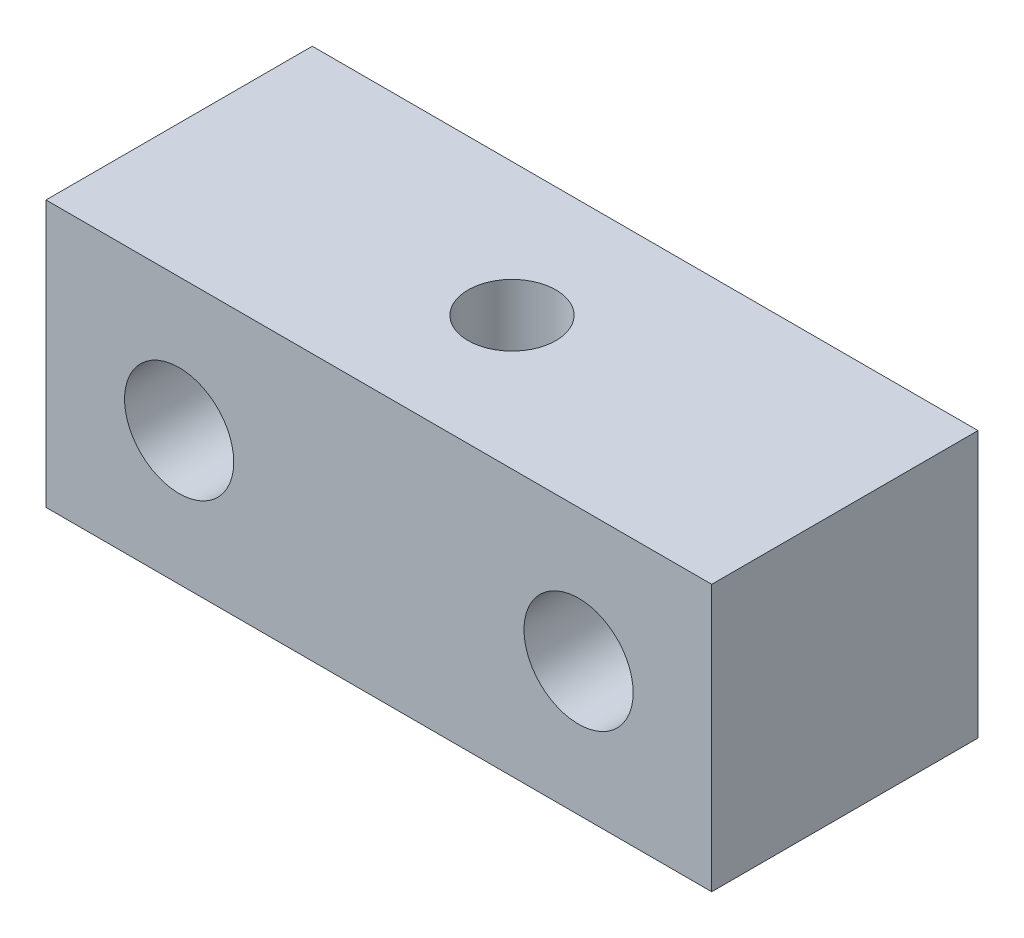
ISO-10303-21;
HEADER;
FILE_DESCRIPTION(('STEP AP214'),'2;1');
FILE_NAME('part.step','',(''),(''),'','','');
FILE_SCHEMA(('AUTOMOTIVE_DESIGN { 1 0 10303 214 1 1 1 1 }'));
ENDSEC;
DATA;
#1=APPLICATION_CONTEXT('core data for automotive mechanical design processes');
#2=APPLICATION_PROTOCOL_DEFINITION('international standard','automotive_design',2000,#1);
#3=PRODUCT_CONTEXT('',#1,'mechanical');
#4=PRODUCT('Part','Part','',(#3));
#5=PRODUCT_RELATED_PRODUCT_CATEGORY('part','',(#4));
#6=PRODUCT_DEFINITION_FORMATION('','',#4);
#7=PRODUCT_DEFINITION_CONTEXT('part definition',#1,'design');
#8=PRODUCT_DEFINITION('design','',#6,#7);
#9=PRODUCT_DEFINITION_SHAPE('','',#8);
#10=(LENGTH_UNIT() NAMED_UNIT(*) SI_UNIT(.MILLI.,.METRE.));
#11=(NAMED_UNIT(*) PLANE_ANGLE_UNIT() SI_UNIT($,.RADIAN.));
#12=(NAMED_UNIT(*) SI_UNIT($,.STERADIAN.) SOLID_ANGLE_UNIT());
#13=UNCERTAINTY_MEASURE_WITH_UNIT(LENGTH_MEASURE(1.E-05),#10,'distance_accuracy_value','');
#14=(GEOMETRIC_REPRESENTATION_CONTEXT(3) GLOBAL_UNCERTAINTY_ASSIGNED_CONTEXT((#13)) GLOBAL_UNIT_ASSIGNED_CONTEXT((#10,
#11,#12)) REPRESENTATION_CONTEXT('',''));
#15=CARTESIAN_POINT('',(0.,0.,0.));
#16=DIRECTION('',(0.,0.,1.));
#17=DIRECTION('',(1.,0.,0.));
#18=AXIS2_PLACEMENT_3D('',#15,#16,#17);
#19=CARTESIAN_POINT('',(25.,-5.,-5.));
#20=DIRECTION('',(0.,0.,1.));
#21=DIRECTION('',(1.,0.,0.));
#22=AXIS2_PLACEMENT_3D('',#19,#20,#21);
#23=PLANE('',#22);
#24=CARTESIAN_POINT('',(5.,0.,-5.));
#25=DIRECTION('',(0.,0.,1.));
#26=DIRECTION('',(1.,0.,0.));
#27=AXIS2_PLACEMENT_3D('',#24,#25,#26);
#28=CIRCLE('',#27,2.05);
#29=CARTESIAN_POINT('',(7.05,0.,-5.));
#30=VERTEX_POINT('',#29);
#31=EDGE_CURVE('E123',#30,#30,#28,.T.);
#32=ORIENTED_EDGE('',*,*,#31,.T.);
#33=EDGE_LOOP('',(#32));
#34=FACE_BOUND('',#33,.T.);
#35=CARTESIAN_POINT('',(20.,0.,-5.));
#36=DIRECTION('',(0.,0.,1.));
#37=DIRECTION('',(1.,0.,0.));
#38=AXIS2_PLACEMENT_3D('',#35,#36,#37);
#39=CIRCLE('',#38,2.05);
#40=CARTESIAN_POINT('',(22.05,0.,-5.));
#41=VERTEX_POINT('',#40);
#42=EDGE_CURVE('E140',#41,#41,#39,.T.);
#43=ORIENTED_EDGE('',*,*,#42,.T.);
#44=EDGE_LOOP('',(#43));
#45=FACE_BOUND('',#44,.T.);
#46=DIRECTION('',(0.,1.,0.));
#47=VECTOR('',#46,1.);
#48=CARTESIAN_POINT('',(0.,-5.,-5.));
#49=LINE('',#48,#47);
#50=CARTESIAN_POINT('',(0.,-5.,-5.));
#51=VERTEX_POINT('',#50);
#52=CARTESIAN_POINT('',(0.,5.,-5.));
#53=VERTEX_POINT('',#52);
#54=EDGE_CURVE('E119',#51,#53,#49,.T.);
#55=ORIENTED_EDGE('',*,*,#54,.T.);
#56=DIRECTION('',(-1.,0.,0.));
#57=VECTOR('',#56,1.);
#58=CARTESIAN_POINT('',(25.,5.,-5.));
#59=LINE('',#58,#57);
#60=CARTESIAN_POINT('',(25.,5.,-5.));
#61=VERTEX_POINT('',#60);
#62=EDGE_CURVE('E11',#61,#53,#59,.T.);
#63=ORIENTED_EDGE('',*,*,#62,.F.);
#64=DIRECTION('',(0.,1.,0.));
#65=VECTOR('',#64,1.);
#66=CARTESIAN_POINT('',(25.,-5.,-5.));
#67=LINE('',#66,#65);
#68=CARTESIAN_POINT('',(25.,-5.,-5.));
#69=VERTEX_POINT('',#68);
#70=EDGE_CURVE('E102',#69,#61,#67,.T.);
#71=ORIENTED_EDGE('',*,*,#70,.F.);
#72=DIRECTION('',(-1.,0.,0.));
#73=VECTOR('',#72,1.);
#74=CARTESIAN_POINT('',(25.,-5.,-5.));
#75=LINE('',#74,#73);
#76=EDGE_CURVE('E115',#69,#51,#75,.T.);
#77=ORIENTED_EDGE('',*,*,#76,.T.);
#78=EDGE_LOOP('',(#55,#63,#71,#77));
#79=FACE_BOUND('',#78,.T.);
#80=ADVANCED_FACE('F49',(#34,#45,#79),#23,.F.);
#81=CARTESIAN_POINT('',(25.,5.,5.));
#82=DIRECTION('',(0.,-1.,0.));
#83=DIRECTION('',(0.,0.,-1.));
#84=AXIS2_PLACEMENT_3D('',#81,#82,#83);
#85=PLANE('',#84);
#86=CARTESIAN_POINT('',(12.5,5.,0.));
#87=DIRECTION('',(0.,1.,0.));
#88=DIRECTION('',(0.,0.,1.));
#89=AXIS2_PLACEMENT_3D('',#86,#87,#88);
#90=CIRCLE('',#89,1.64999999999999);
#91=CARTESIAN_POINT('',(12.5,5.,1.64999999999999));
#92=VERTEX_POINT('',#91);
#93=EDGE_CURVE('E155',#92,#92,#90,.T.);
#94=ORIENTED_EDGE('',*,*,#93,.F.);
#95=EDGE_LOOP('',(#94));
#96=FACE_BOUND('',#95,.T.);
#97=DIRECTION('',(0.,0.,1.));
#98=VECTOR('',#97,1.);
#99=CARTESIAN_POINT('',(0.,5.,5.));
#100=LINE('',#99,#98);
#101=CARTESIAN_POINT('',(0.,5.,5.));
#102=VERTEX_POINT('',#101);
#103=EDGE_CURVE('E107',#53,#102,#100,.T.);
#104=ORIENTED_EDGE('',*,*,#103,.T.);
#105=DIRECTION('',(-1.,0.,0.));
#106=VECTOR('',#105,1.);
#107=CARTESIAN_POINT('',(25.,5.,5.));
#108=LINE('',#107,#106);
#109=CARTESIAN_POINT('',(25.,5.,5.));
#110=VERTEX_POINT('',#109);
#111=EDGE_CURVE('E59',#110,#102,#108,.T.);
#112=ORIENTED_EDGE('',*,*,#111,.F.);
#113=DIRECTION('',(0.,0.,1.));
#114=VECTOR('',#113,1.);
#115=CARTESIAN_POINT('',(25.,5.,5.));
#116=LINE('',#115,#114);
#117=EDGE_CURVE('E97',#61,#110,#116,.T.);
#118=ORIENTED_EDGE('',*,*,#117,.F.);
#119=ORIENTED_EDGE('',*,*,#62,.T.);
#120=EDGE_LOOP('',(#104,#112,#118,#119));
#121=FACE_BOUND('',#120,.T.);
#122=ADVANCED_FACE('F106',(#96,#121),#85,.F.);
#123=CARTESIAN_POINT('',(25.,-5.,5.));
#124=DIRECTION('',(0.,0.,-1.));
#125=DIRECTION('',(-1.,0.,0.));
#126=AXIS2_PLACEMENT_3D('',#123,#124,#125);
#127=PLANE('',#126);
#128=CARTESIAN_POINT('',(5.,0.,5.));
#129=DIRECTION('',(0.,0.,1.));
#130=DIRECTION('',(1.,0.,0.));
#131=AXIS2_PLACEMENT_3D('',#128,#129,#130);
#132=CIRCLE('',#131,2.05);
#133=CARTESIAN_POINT('',(7.05,0.,5.));
#134=VERTEX_POINT('',#133);
#135=EDGE_CURVE('E148',#134,#134,#132,.T.);
#136=ORIENTED_EDGE('',*,*,#135,.F.);
#137=EDGE_LOOP('',(#136));
#138=FACE_BOUND('',#137,.T.);
#139=CARTESIAN_POINT('',(20.,0.,5.));
#140=DIRECTION('',(0.,0.,1.));
#141=DIRECTION('',(1.,0.,0.));
#142=AXIS2_PLACEMENT_3D('',#139,#140,#141);
#143=CIRCLE('',#142,2.05);
#144=CARTESIAN_POINT('',(22.05,0.,5.));
#145=VERTEX_POINT('',#144);
#146=EDGE_CURVE('E144',#145,#145,#143,.T.);
#147=ORIENTED_EDGE('',*,*,#146,.F.);
#148=EDGE_LOOP('',(#147));
#149=FACE_BOUND('',#148,.T.);
#150=DIRECTION('',(0.,-1.,0.));
#151=VECTOR('',#150,1.);
#152=CARTESIAN_POINT('',(0.,-5.,5.));
#153=LINE('',#152,#151);
#154=CARTESIAN_POINT('',(0.,-5.,5.));
#155=VERTEX_POINT('',#154);
#156=EDGE_CURVE('E84',#102,#155,#153,.T.);
#157=ORIENTED_EDGE('',*,*,#156,.T.);
#158=DIRECTION('',(-1.,0.,0.));
#159=VECTOR('',#158,1.);
#160=CARTESIAN_POINT('',(25.,-5.,5.));
#161=LINE('',#160,#159);
#162=CARTESIAN_POINT('',(25.,-5.,5.));
#163=VERTEX_POINT('',#162);
#164=EDGE_CURVE('E109',#163,#155,#161,.T.);
#165=ORIENTED_EDGE('',*,*,#164,.F.);
#166=DIRECTION('',(0.,-1.,0.));
#167=VECTOR('',#166,1.);
#168=CARTESIAN_POINT('',(25.,-5.,5.));
#169=LINE('',#168,#167);
#170=EDGE_CURVE('E100',#110,#163,#169,.T.);
#171=ORIENTED_EDGE('',*,*,#170,.F.);
#172=ORIENTED_EDGE('',*,*,#111,.T.);
#173=EDGE_LOOP('',(#157,#165,#171,#172));
#174=FACE_BOUND('',#173,.T.);
#175=ADVANCED_FACE('F111',(#138,#149,#174),#127,.F.);
#176=CARTESIAN_POINT('',(25.,-5.,5.));
#177=DIRECTION('',(0.,1.,0.));
#178=DIRECTION('',(0.,0.,1.));
#179=AXIS2_PLACEMENT_3D('',#176,#177,#178);
#180=PLANE('',#179);
#181=CARTESIAN_POINT('',(12.5,-5.,0.));
#182=DIRECTION('',(0.,1.,0.));
#183=DIRECTION('',(0.,0.,1.));
#184=AXIS2_PLACEMENT_3D('',#181,#182,#183);
#185=CIRCLE('',#184,1.64999999999999);
#186=CARTESIAN_POINT('',(12.5,-5.,1.64999999999999));
#187=VERTEX_POINT('',#186);
#188=EDGE_CURVE('E52',#187,#187,#185,.T.);
#189=ORIENTED_EDGE('',*,*,#188,.T.);
#190=EDGE_LOOP('',(#189));
#191=FACE_BOUND('',#190,.T.);
#192=DIRECTION('',(0.,0.,-1.));
#193=VECTOR('',#192,1.);
#194=CARTESIAN_POINT('',(0.,-5.,5.));
#195=LINE('',#194,#193);
#196=EDGE_CURVE('E90',#155,#51,#195,.T.);
#197=ORIENTED_EDGE('',*,*,#196,.T.);
#198=ORIENTED_EDGE('',*,*,#76,.F.);
#199=DIRECTION('',(0.,0.,-1.));
#200=VECTOR('',#199,1.);
#201=CARTESIAN_POINT('',(25.,-5.,5.));
#202=LINE('',#201,#200);
#203=EDGE_CURVE('E67',#163,#69,#202,.T.);
#204=ORIENTED_EDGE('',*,*,#203,.F.);
#205=ORIENTED_EDGE('',*,*,#164,.T.);
#206=EDGE_LOOP('',(#197,#198,#204,#205));
#207=FACE_BOUND('',#206,.T.);
#208=ADVANCED_FACE('F133',(#191,#207),#180,.F.);
#209=CARTESIAN_POINT('',(25.,0.,0.));
#210=DIRECTION('',(-1.,0.,0.));
#211=DIRECTION('',(0.,0.,1.));
#212=AXIS2_PLACEMENT_3D('',#209,#210,#211);
#213=PLANE('',#212);
#214=ORIENTED_EDGE('',*,*,#70,.T.);
#215=ORIENTED_EDGE('',*,*,#117,.T.);
#216=ORIENTED_EDGE('',*,*,#170,.T.);
#217=ORIENTED_EDGE('',*,*,#203,.T.);
#218=EDGE_LOOP('',(#214,#215,#216,#217));
#219=FACE_BOUND('',#218,.T.);
#220=ADVANCED_FACE('F98',(#219),#213,.F.);
#221=CARTESIAN_POINT('',(0.,0.,0.));
#222=DIRECTION('',(-1.,0.,0.));
#223=DIRECTION('',(0.,0.,1.));
#224=AXIS2_PLACEMENT_3D('',#221,#222,#223);
#225=PLANE('',#224);
#226=ORIENTED_EDGE('',*,*,#54,.F.);
#227=ORIENTED_EDGE('',*,*,#196,.F.);
#228=ORIENTED_EDGE('',*,*,#156,.F.);
#229=ORIENTED_EDGE('',*,*,#103,.F.);
#230=EDGE_LOOP('',(#226,#227,#228,#229));
#231=FACE_BOUND('',#230,.T.);
#232=ADVANCED_FACE('F136',(#231),#225,.T.);
#233=CARTESIAN_POINT('',(20.,0.,-5.));
#234=DIRECTION('',(0.,0.,1.));
#235=DIRECTION('',(1.,0.,0.));
#236=AXIS2_PLACEMENT_3D('',#233,#234,#235);
#237=CYLINDRICAL_SURFACE('',#236,2.05);
#238=ORIENTED_EDGE('',*,*,#42,.F.);
#239=EDGE_LOOP('',(#238));
#240=FACE_BOUND('',#239,.T.);
#241=ORIENTED_EDGE('',*,*,#146,.T.);
#242=EDGE_LOOP('',(#241));
#243=FACE_BOUND('',#242,.T.);
#244=ADVANCED_FACE('F172',(#240,#243),#237,.F.);
#245=CARTESIAN_POINT('',(5.,0.,-5.));
#246=DIRECTION('',(0.,0.,1.));
#247=DIRECTION('',(1.,0.,0.));
#248=AXIS2_PLACEMENT_3D('',#245,#246,#247);
#249=CYLINDRICAL_SURFACE('',#248,2.05);
#250=ORIENTED_EDGE('',*,*,#31,.F.);
#251=EDGE_LOOP('',(#250));
#252=FACE_BOUND('',#251,.T.);
#253=ORIENTED_EDGE('',*,*,#135,.T.);
#254=EDGE_LOOP('',(#253));
#255=FACE_BOUND('',#254,.T.);
#256=ADVANCED_FACE('F167',(#252,#255),#249,.F.);
#257=CARTESIAN_POINT('',(12.5,5.,0.));
#258=DIRECTION('',(0.,1.,0.));
#259=DIRECTION('',(0.,0.,1.));
#260=AXIS2_PLACEMENT_3D('',#257,#258,#259);
#261=CYLINDRICAL_SURFACE('',#260,1.64999999999999);
#262=ORIENTED_EDGE('',*,*,#93,.T.);
#263=EDGE_LOOP('',(#262));
#264=FACE_BOUND('',#263,.T.);
#265=ORIENTED_EDGE('',*,*,#188,.F.);
#266=EDGE_LOOP('',(#265));
#267=FACE_BOUND('',#266,.T.);
#268=ADVANCED_FACE('F165',(#264,#267),#261,.F.);
#269=CLOSED_SHELL('',(#80,#122,#175,#208,#220,#232,#244,#256,#268));
#270=MANIFOLD_SOLID_BREP('B2',#269);
#271=ADVANCED_BREP_SHAPE_REPRESENTATION('',(#18,#270),#14);
#272=SHAPE_DEFINITION_REPRESENTATION(#9,#271);
ENDSEC;
END-ISO-10303-21;
